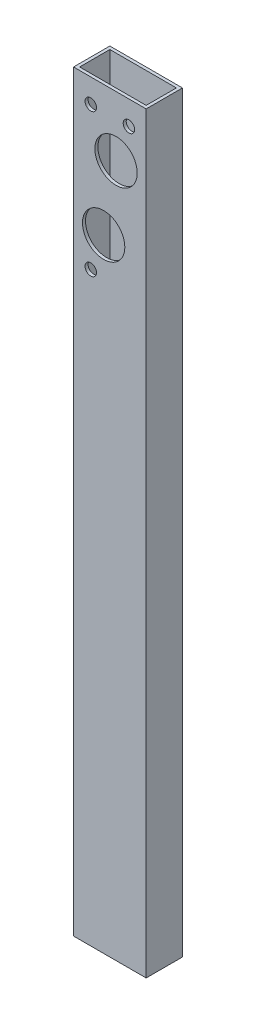
ISO-10303-21;
HEADER;
FILE_DESCRIPTION(('STEP AP214'),'2;1');
FILE_NAME('part.step','',(''),(''),'','','');
FILE_SCHEMA(('AUTOMOTIVE_DESIGN { 1 0 10303 214 1 1 1 1 }'));
ENDSEC;
DATA;
#1=APPLICATION_CONTEXT('core data for automotive mechanical design processes');
#2=APPLICATION_PROTOCOL_DEFINITION('international standard','automotive_design',2000,#1);
#3=PRODUCT_CONTEXT('',#1,'mechanical');
#4=PRODUCT('Part','Part','',(#3));
#5=PRODUCT_RELATED_PRODUCT_CATEGORY('part','',(#4));
#6=PRODUCT_DEFINITION_FORMATION('','',#4);
#7=PRODUCT_DEFINITION_CONTEXT('part definition',#1,'design');
#8=PRODUCT_DEFINITION('design','',#6,#7);
#9=PRODUCT_DEFINITION_SHAPE('','',#8);
#10=(LENGTH_UNIT() NAMED_UNIT(*) SI_UNIT(.MILLI.,.METRE.));
#11=(NAMED_UNIT(*) PLANE_ANGLE_UNIT() SI_UNIT($,.RADIAN.));
#12=(NAMED_UNIT(*) SI_UNIT($,.STERADIAN.) SOLID_ANGLE_UNIT());
#13=UNCERTAINTY_MEASURE_WITH_UNIT(LENGTH_MEASURE(1.E-05),#10,'distance_accuracy_value','');
#14=(GEOMETRIC_REPRESENTATION_CONTEXT(3) GLOBAL_UNCERTAINTY_ASSIGNED_CONTEXT((#13)) GLOBAL_UNIT_ASSIGNED_CONTEXT((#10,
#11,#12)) REPRESENTATION_CONTEXT('',''));
#15=CARTESIAN_POINT('',(0.,0.,0.));
#16=DIRECTION('',(0.,0.,1.));
#17=DIRECTION('',(1.,0.,0.));
#18=AXIS2_PLACEMENT_3D('',#15,#16,#17);
#19=CARTESIAN_POINT('',(38.1,-280.,-19.05));
#20=DIRECTION('',(1.,0.,0.));
#21=DIRECTION('',(0.,0.,-1.));
#22=AXIS2_PLACEMENT_3D('',#19,#20,#21);
#23=PLANE('',#22);
#24=DIRECTION('',(0.,1.,0.));
#25=VECTOR('',#24,1.);
#26=CARTESIAN_POINT('',(38.1,-280.,-19.05));
#27=LINE('',#26,#25);
#28=CARTESIAN_POINT('',(38.1,-280.,-19.05));
#29=VERTEX_POINT('',#28);
#30=CARTESIAN_POINT('',(38.1,510.,-19.05));
#31=VERTEX_POINT('',#30);
#32=EDGE_CURVE('E106',#29,#31,#27,.T.);
#33=ORIENTED_EDGE('',*,*,#32,.T.);
#34=DIRECTION('',(0.,0.,-1.));
#35=VECTOR('',#34,1.);
#36=CARTESIAN_POINT('',(38.1,510.,-19.05));
#37=LINE('',#36,#35);
#38=CARTESIAN_POINT('',(38.1,510.,19.05));
#39=VERTEX_POINT('',#38);
#40=EDGE_CURVE('E216',#39,#31,#37,.T.);
#41=ORIENTED_EDGE('',*,*,#40,.F.);
#42=DIRECTION('',(0.,1.,0.));
#43=VECTOR('',#42,1.);
#44=CARTESIAN_POINT('',(38.1,-280.,19.05));
#45=LINE('',#44,#43);
#46=CARTESIAN_POINT('',(38.1,-280.,19.05));
#47=VERTEX_POINT('',#46);
#48=EDGE_CURVE('E14',#47,#39,#45,.T.);
#49=ORIENTED_EDGE('',*,*,#48,.F.);
#50=DIRECTION('',(0.,0.,-1.));
#51=VECTOR('',#50,1.);
#52=CARTESIAN_POINT('',(38.1,-280.,-19.05));
#53=LINE('',#52,#51);
#54=EDGE_CURVE('E244',#47,#29,#53,.T.);
#55=ORIENTED_EDGE('',*,*,#54,.T.);
#56=EDGE_LOOP('',(#33,#41,#49,#55));
#57=FACE_BOUND('',#56,.T.);
#58=ADVANCED_FACE('F103',(#57),#23,.T.);
#59=CARTESIAN_POINT('',(-38.1,-280.,19.05));
#60=DIRECTION('',(0.,0.,1.));
#61=DIRECTION('',(1.,0.,0.));
#62=AXIS2_PLACEMENT_3D('',#59,#60,#61);
#63=PLANE('',#62);
#64=CARTESIAN_POINT('',(-20.,485.,19.05));
#65=DIRECTION('',(0.,0.,1.));
#66=DIRECTION('',(1.,0.,0.));
#67=AXIS2_PLACEMENT_3D('',#64,#65,#66);
#68=CIRCLE('',#67,6.);
#69=CARTESIAN_POINT('',(-14.,485.,19.05));
#70=VERTEX_POINT('',#69);
#71=EDGE_CURVE('E589',#70,#70,#68,.T.);
#72=ORIENTED_EDGE('',*,*,#71,.F.);
#73=EDGE_LOOP('',(#72));
#74=FACE_BOUND('',#73,.T.);
#75=CARTESIAN_POINT('',(20.,485.,19.05));
#76=DIRECTION('',(0.,0.,1.));
#77=DIRECTION('',(1.,0.,0.));
#78=AXIS2_PLACEMENT_3D('',#75,#76,#77);
#79=CIRCLE('',#78,6.);
#80=CARTESIAN_POINT('',(26.,485.,19.05));
#81=VERTEX_POINT('',#80);
#82=EDGE_CURVE('E597',#81,#81,#79,.T.);
#83=ORIENTED_EDGE('',*,*,#82,.F.);
#84=EDGE_LOOP('',(#83));
#85=FACE_BOUND('',#84,.T.);
#86=CARTESIAN_POINT('',(-20.,335.,19.05));
#87=DIRECTION('',(0.,0.,1.));
#88=DIRECTION('',(1.,0.,0.));
#89=AXIS2_PLACEMENT_3D('',#86,#87,#88);
#90=CIRCLE('',#89,6.);
#91=CARTESIAN_POINT('',(-14.,335.,19.05));
#92=VERTEX_POINT('',#91);
#93=EDGE_CURVE('E605',#92,#92,#90,.T.);
#94=ORIENTED_EDGE('',*,*,#93,.F.);
#95=EDGE_LOOP('',(#94));
#96=FACE_BOUND('',#95,.T.);
#97=CARTESIAN_POINT('',(6.51180666250989,446.930290737958,19.05));
#98=DIRECTION('',(0.,0.,1.));
#99=DIRECTION('',(1.,0.,0.));
#100=AXIS2_PLACEMENT_3D('',#97,#98,#99);
#101=CIRCLE('',#100,22.2249999999999);
#102=CARTESIAN_POINT('',(28.7368066625098,446.930290737958,19.05));
#103=VERTEX_POINT('',#102);
#104=EDGE_CURVE('E614',#103,#103,#101,.T.);
#105=ORIENTED_EDGE('',*,*,#104,.F.);
#106=EDGE_LOOP('',(#105));
#107=FACE_BOUND('',#106,.T.);
#108=CARTESIAN_POINT('',(-6.5118066625099,373.069709262042,19.05));
#109=DIRECTION('',(0.,0.,1.));
#110=DIRECTION('',(1.,0.,0.));
#111=AXIS2_PLACEMENT_3D('',#108,#109,#110);
#112=CIRCLE('',#111,22.225);
#113=CARTESIAN_POINT('',(15.7131933374901,373.069709262042,19.05));
#114=VERTEX_POINT('',#113);
#115=EDGE_CURVE('E613',#114,#114,#112,.T.);
#116=ORIENTED_EDGE('',*,*,#115,.F.);
#117=EDGE_LOOP('',(#116));
#118=FACE_BOUND('',#117,.T.);
#119=ORIENTED_EDGE('',*,*,#48,.T.);
#120=DIRECTION('',(1.,0.,0.));
#121=VECTOR('',#120,1.);
#122=CARTESIAN_POINT('',(-38.1,510.,19.05));
#123=LINE('',#122,#121);
#124=CARTESIAN_POINT('',(-38.1,510.,19.05));
#125=VERTEX_POINT('',#124);
#126=EDGE_CURVE('E228',#125,#39,#123,.T.);
#127=ORIENTED_EDGE('',*,*,#126,.F.);
#128=DIRECTION('',(0.,1.,0.));
#129=VECTOR('',#128,1.);
#130=CARTESIAN_POINT('',(-38.1,-280.,19.05));
#131=LINE('',#130,#129);
#132=CARTESIAN_POINT('',(-38.1,-280.,19.05));
#133=VERTEX_POINT('',#132);
#134=EDGE_CURVE('E112',#133,#125,#131,.T.);
#135=ORIENTED_EDGE('',*,*,#134,.F.);
#136=DIRECTION('',(1.,0.,0.));
#137=VECTOR('',#136,1.);
#138=CARTESIAN_POINT('',(-38.1,-280.,19.05));
#139=LINE('',#138,#137);
#140=EDGE_CURVE('E260',#133,#47,#139,.T.);
#141=ORIENTED_EDGE('',*,*,#140,.T.);
#142=EDGE_LOOP('',(#119,#127,#135,#141));
#143=FACE_BOUND('',#142,.T.);
#144=ADVANCED_FACE('F280',(#74,#85,#96,#107,#118,#143),#63,.T.);
#145=CARTESIAN_POINT('',(-38.1,-280.,-19.05));
#146=DIRECTION('',(-1.,0.,0.));
#147=DIRECTION('',(0.,0.,1.));
#148=AXIS2_PLACEMENT_3D('',#145,#146,#147);
#149=PLANE('',#148);
#150=ORIENTED_EDGE('',*,*,#134,.T.);
#151=DIRECTION('',(0.,0.,1.));
#152=VECTOR('',#151,1.);
#153=CARTESIAN_POINT('',(-38.1,510.,-19.05));
#154=LINE('',#153,#152);
#155=CARTESIAN_POINT('',(-38.1,510.,-19.05));
#156=VERTEX_POINT('',#155);
#157=EDGE_CURVE('E224',#156,#125,#154,.T.);
#158=ORIENTED_EDGE('',*,*,#157,.F.);
#159=DIRECTION('',(0.,1.,0.));
#160=VECTOR('',#159,1.);
#161=CARTESIAN_POINT('',(-38.1,-280.,-19.05));
#162=LINE('',#161,#160);
#163=CARTESIAN_POINT('',(-38.1,-280.,-19.05));
#164=VERTEX_POINT('',#163);
#165=EDGE_CURVE('E265',#164,#156,#162,.T.);
#166=ORIENTED_EDGE('',*,*,#165,.F.);
#167=DIRECTION('',(0.,0.,1.));
#168=VECTOR('',#167,1.);
#169=CARTESIAN_POINT('',(-38.1,-280.,-19.05));
#170=LINE('',#169,#168);
#171=EDGE_CURVE('E256',#164,#133,#170,.T.);
#172=ORIENTED_EDGE('',*,*,#171,.T.);
#173=EDGE_LOOP('',(#150,#158,#166,#172));
#174=FACE_BOUND('',#173,.T.);
#175=ADVANCED_FACE('F286',(#174),#149,.T.);
#176=CARTESIAN_POINT('',(-38.1,-280.,-19.05));
#177=DIRECTION('',(0.,0.,-1.));
#178=DIRECTION('',(-1.,0.,0.));
#179=AXIS2_PLACEMENT_3D('',#176,#177,#178);
#180=PLANE('',#179);
#181=CARTESIAN_POINT('',(0.,-50.,-19.05));
#182=DIRECTION('',(0.,0.,-1.));
#183=DIRECTION('',(-1.,0.,0.));
#184=AXIS2_PLACEMENT_3D('',#181,#182,#183);
#185=CIRCLE('',#184,22.225);
#186=CARTESIAN_POINT('',(-22.225,-50.,-19.05));
#187=VERTEX_POINT('',#186);
#188=EDGE_CURVE('E538',#187,#187,#185,.T.);
#189=ORIENTED_EDGE('',*,*,#188,.F.);
#190=EDGE_LOOP('',(#189));
#191=FACE_BOUND('',#190,.T.);
#192=CARTESIAN_POINT('',(0.,-220.,-19.05));
#193=DIRECTION('',(0.,0.,-1.));
#194=DIRECTION('',(-1.,0.,0.));
#195=AXIS2_PLACEMENT_3D('',#192,#193,#194);
#196=CIRCLE('',#195,22.225);
#197=CARTESIAN_POINT('',(-22.225,-220.,-19.05));
#198=VERTEX_POINT('',#197);
#199=EDGE_CURVE('E543',#198,#198,#196,.T.);
#200=ORIENTED_EDGE('',*,*,#199,.F.);
#201=EDGE_LOOP('',(#200));
#202=FACE_BOUND('',#201,.T.);
#203=CARTESIAN_POINT('',(20.,-15.,-19.05));
#204=DIRECTION('',(0.,0.,-1.));
#205=DIRECTION('',(-1.,0.,0.));
#206=AXIS2_PLACEMENT_3D('',#203,#204,#205);
#207=CIRCLE('',#206,6.);
#208=CARTESIAN_POINT('',(14.,-15.,-19.05));
#209=VERTEX_POINT('',#208);
#210=EDGE_CURVE('E549',#209,#209,#207,.T.);
#211=ORIENTED_EDGE('',*,*,#210,.F.);
#212=EDGE_LOOP('',(#211));
#213=FACE_BOUND('',#212,.T.);
#214=CARTESIAN_POINT('',(-20.,-255.,-19.05));
#215=DIRECTION('',(0.,0.,-1.));
#216=DIRECTION('',(-1.,0.,0.));
#217=AXIS2_PLACEMENT_3D('',#214,#215,#216);
#218=CIRCLE('',#217,6.);
#219=CARTESIAN_POINT('',(-26.,-255.,-19.05));
#220=VERTEX_POINT('',#219);
#221=EDGE_CURVE('E565',#220,#220,#218,.T.);
#222=ORIENTED_EDGE('',*,*,#221,.F.);
#223=EDGE_LOOP('',(#222));
#224=FACE_BOUND('',#223,.T.);
#225=CARTESIAN_POINT('',(20.,-255.,-19.05));
#226=DIRECTION('',(0.,0.,-1.));
#227=DIRECTION('',(-1.,0.,0.));
#228=AXIS2_PLACEMENT_3D('',#225,#226,#227);
#229=CIRCLE('',#228,6.);
#230=CARTESIAN_POINT('',(14.,-255.,-19.05));
#231=VERTEX_POINT('',#230);
#232=EDGE_CURVE('E573',#231,#231,#229,.T.);
#233=ORIENTED_EDGE('',*,*,#232,.F.);
#234=EDGE_LOOP('',(#233));
#235=FACE_BOUND('',#234,.T.);
#236=CARTESIAN_POINT('',(-20.,-15.,-19.05));
#237=DIRECTION('',(0.,0.,-1.));
#238=DIRECTION('',(-1.,0.,0.));
#239=AXIS2_PLACEMENT_3D('',#236,#237,#238);
#240=CIRCLE('',#239,6.);
#241=CARTESIAN_POINT('',(-26.,-15.,-19.05));
#242=VERTEX_POINT('',#241);
#243=EDGE_CURVE('E581',#242,#242,#240,.T.);
#244=ORIENTED_EDGE('',*,*,#243,.F.);
#245=EDGE_LOOP('',(#244));
#246=FACE_BOUND('',#245,.T.);
#247=ORIENTED_EDGE('',*,*,#165,.T.);
#248=DIRECTION('',(-1.,0.,0.));
#249=VECTOR('',#248,1.);
#250=CARTESIAN_POINT('',(-38.1,510.,-19.05));
#251=LINE('',#250,#249);
#252=EDGE_CURVE('E220',#31,#156,#251,.T.);
#253=ORIENTED_EDGE('',*,*,#252,.F.);
#254=ORIENTED_EDGE('',*,*,#32,.F.);
#255=DIRECTION('',(-1.,0.,0.));
#256=VECTOR('',#255,1.);
#257=CARTESIAN_POINT('',(-38.1,-280.,-19.05));
#258=LINE('',#257,#256);
#259=EDGE_CURVE('E252',#29,#164,#258,.T.);
#260=ORIENTED_EDGE('',*,*,#259,.T.);
#261=EDGE_LOOP('',(#247,#253,#254,#260));
#262=FACE_BOUND('',#261,.T.);
#263=ADVANCED_FACE('F275',(#191,#202,#213,#224,#235,#246,#262),#180,.T.);
#264=CARTESIAN_POINT('',(0.,-280.,0.));
#265=DIRECTION('',(0.,1.,0.));
#266=DIRECTION('',(0.,0.,1.));
#267=AXIS2_PLACEMENT_3D('',#264,#265,#266);
#268=PLANE('',#267);
#269=DIRECTION('',(1.,0.,0.));
#270=VECTOR('',#269,1.);
#271=CARTESIAN_POINT('',(-38.1,-280.,15.875));
#272=LINE('',#271,#270);
#273=CARTESIAN_POINT('',(-34.925,-280.,15.875));
#274=VERTEX_POINT('',#273);
#275=CARTESIAN_POINT('',(34.925,-280.,15.875));
#276=VERTEX_POINT('',#275);
#277=EDGE_CURVE('E190',#274,#276,#272,.T.);
#278=ORIENTED_EDGE('',*,*,#277,.T.);
#279=DIRECTION('',(0.,0.,-1.));
#280=VECTOR('',#279,1.);
#281=CARTESIAN_POINT('',(34.925,-280.,-19.05));
#282=LINE('',#281,#280);
#283=CARTESIAN_POINT('',(34.925,-280.,-15.875));
#284=VERTEX_POINT('',#283);
#285=EDGE_CURVE('E232',#276,#284,#282,.T.);
#286=ORIENTED_EDGE('',*,*,#285,.T.);
#287=DIRECTION('',(-1.,0.,0.));
#288=VECTOR('',#287,1.);
#289=CARTESIAN_POINT('',(-38.1,-280.,-15.875));
#290=LINE('',#289,#288);
#291=CARTESIAN_POINT('',(-34.925,-280.,-15.875));
#292=VERTEX_POINT('',#291);
#293=EDGE_CURVE('E184',#284,#292,#290,.T.);
#294=ORIENTED_EDGE('',*,*,#293,.T.);
#295=DIRECTION('',(0.,0.,1.));
#296=VECTOR('',#295,1.);
#297=CARTESIAN_POINT('',(-34.925,-280.,-19.05));
#298=LINE('',#297,#296);
#299=EDGE_CURVE('E120',#292,#274,#298,.T.);
#300=ORIENTED_EDGE('',*,*,#299,.T.);
#301=EDGE_LOOP('',(#278,#286,#294,#300));
#302=FACE_BOUND('',#301,.T.);
#303=ORIENTED_EDGE('',*,*,#54,.F.);
#304=ORIENTED_EDGE('',*,*,#140,.F.);
#305=ORIENTED_EDGE('',*,*,#171,.F.);
#306=ORIENTED_EDGE('',*,*,#259,.F.);
#307=EDGE_LOOP('',(#303,#304,#305,#306));
#308=FACE_BOUND('',#307,.T.);
#309=ADVANCED_FACE('F284',(#302,#308),#268,.F.);
#310=CARTESIAN_POINT('',(34.925,-280.,-19.05));
#311=DIRECTION('',(1.,0.,0.));
#312=DIRECTION('',(0.,0.,-1.));
#313=AXIS2_PLACEMENT_3D('',#310,#311,#312);
#314=PLANE('',#313);
#315=DIRECTION('',(0.,1.,0.));
#316=VECTOR('',#315,1.);
#317=CARTESIAN_POINT('',(34.925,-280.,15.875));
#318=LINE('',#317,#316);
#319=CARTESIAN_POINT('',(34.925,510.,15.875));
#320=VERTEX_POINT('',#319);
#321=EDGE_CURVE('E195',#276,#320,#318,.T.);
#322=ORIENTED_EDGE('',*,*,#321,.T.);
#323=DIRECTION('',(0.,0.,-1.));
#324=VECTOR('',#323,1.);
#325=CARTESIAN_POINT('',(34.925,510.,-19.05));
#326=LINE('',#325,#324);
#327=CARTESIAN_POINT('',(34.925,510.,-15.875));
#328=VERTEX_POINT('',#327);
#329=EDGE_CURVE('E193',#320,#328,#326,.T.);
#330=ORIENTED_EDGE('',*,*,#329,.T.);
#331=DIRECTION('',(0.,1.,0.));
#332=VECTOR('',#331,1.);
#333=CARTESIAN_POINT('',(34.925,-280.,-15.875));
#334=LINE('',#333,#332);
#335=EDGE_CURVE('E177',#284,#328,#334,.T.);
#336=ORIENTED_EDGE('',*,*,#335,.F.);
#337=ORIENTED_EDGE('',*,*,#285,.F.);
#338=EDGE_LOOP('',(#322,#330,#336,#337));
#339=FACE_BOUND('',#338,.T.);
#340=ADVANCED_FACE('F194',(#339),#314,.F.);
#341=CARTESIAN_POINT('',(-38.1,-280.,15.875));
#342=DIRECTION('',(0.,0.,1.));
#343=DIRECTION('',(1.,0.,0.));
#344=AXIS2_PLACEMENT_3D('',#341,#342,#343);
#345=PLANE('',#344);
#346=CARTESIAN_POINT('',(-20.,485.,15.875));
#347=DIRECTION('',(0.,0.,1.));
#348=DIRECTION('',(1.,0.,0.));
#349=AXIS2_PLACEMENT_3D('',#346,#347,#348);
#350=CIRCLE('',#349,6.);
#351=CARTESIAN_POINT('',(-14.,485.,15.875));
#352=VERTEX_POINT('',#351);
#353=EDGE_CURVE('E593',#352,#352,#350,.T.);
#354=ORIENTED_EDGE('',*,*,#353,.T.);
#355=EDGE_LOOP('',(#354));
#356=FACE_BOUND('',#355,.T.);
#357=CARTESIAN_POINT('',(20.,485.,15.875));
#358=DIRECTION('',(0.,0.,1.));
#359=DIRECTION('',(1.,0.,0.));
#360=AXIS2_PLACEMENT_3D('',#357,#358,#359);
#361=CIRCLE('',#360,6.);
#362=CARTESIAN_POINT('',(26.,485.,15.875));
#363=VERTEX_POINT('',#362);
#364=EDGE_CURVE('E601',#363,#363,#361,.T.);
#365=ORIENTED_EDGE('',*,*,#364,.T.);
#366=EDGE_LOOP('',(#365));
#367=FACE_BOUND('',#366,.T.);
#368=CARTESIAN_POINT('',(-20.,335.,15.875));
#369=DIRECTION('',(0.,0.,1.));
#370=DIRECTION('',(1.,0.,0.));
#371=AXIS2_PLACEMENT_3D('',#368,#369,#370);
#372=CIRCLE('',#371,6.);
#373=CARTESIAN_POINT('',(-14.,335.,15.875));
#374=VERTEX_POINT('',#373);
#375=EDGE_CURVE('E609',#374,#374,#372,.T.);
#376=ORIENTED_EDGE('',*,*,#375,.T.);
#377=EDGE_LOOP('',(#376));
#378=FACE_BOUND('',#377,.T.);
#379=CARTESIAN_POINT('',(6.51180666250989,446.930290737958,15.875));
#380=DIRECTION('',(0.,0.,1.));
#381=DIRECTION('',(1.,0.,0.));
#382=AXIS2_PLACEMENT_3D('',#379,#380,#381);
#383=CIRCLE('',#382,22.2249999999999);
#384=CARTESIAN_POINT('',(28.7368066625098,446.930290737958,15.875));
#385=VERTEX_POINT('',#384);
#386=EDGE_CURVE('E200',#385,#385,#383,.F.);
#387=ORIENTED_EDGE('',*,*,#386,.F.);
#388=EDGE_LOOP('',(#387));
#389=FACE_BOUND('',#388,.T.);
#390=CARTESIAN_POINT('',(-6.5118066625099,373.069709262042,15.875));
#391=DIRECTION('',(0.,0.,1.));
#392=DIRECTION('',(1.,0.,0.));
#393=AXIS2_PLACEMENT_3D('',#390,#391,#392);
#394=CIRCLE('',#393,22.225);
#395=CARTESIAN_POINT('',(15.7131933374901,373.069709262042,15.875));
#396=VERTEX_POINT('',#395);
#397=EDGE_CURVE('E618',#396,#396,#394,.F.);
#398=ORIENTED_EDGE('',*,*,#397,.F.);
#399=EDGE_LOOP('',(#398));
#400=FACE_BOUND('',#399,.T.);
#401=DIRECTION('',(0.,1.,0.));
#402=VECTOR('',#401,1.);
#403=CARTESIAN_POINT('',(-34.925,-280.,15.875));
#404=LINE('',#403,#402);
#405=CARTESIAN_POINT('',(-34.925,510.,15.875));
#406=VERTEX_POINT('',#405);
#407=EDGE_CURVE('E245',#274,#406,#404,.T.);
#408=ORIENTED_EDGE('',*,*,#407,.T.);
#409=DIRECTION('',(1.,0.,0.));
#410=VECTOR('',#409,1.);
#411=CARTESIAN_POINT('',(-38.1,510.,15.875));
#412=LINE('',#411,#410);
#413=EDGE_CURVE('E210',#406,#320,#412,.T.);
#414=ORIENTED_EDGE('',*,*,#413,.T.);
#415=ORIENTED_EDGE('',*,*,#321,.F.);
#416=ORIENTED_EDGE('',*,*,#277,.F.);
#417=EDGE_LOOP('',(#408,#414,#415,#416));
#418=FACE_BOUND('',#417,.T.);
#419=ADVANCED_FACE('F332',(#356,#367,#378,#389,#400,#418),#345,.F.);
#420=CARTESIAN_POINT('',(-34.925,-280.,-19.05));
#421=DIRECTION('',(-1.,0.,0.));
#422=DIRECTION('',(0.,0.,1.));
#423=AXIS2_PLACEMENT_3D('',#420,#421,#422);
#424=PLANE('',#423);
#425=DIRECTION('',(0.,1.,0.));
#426=VECTOR('',#425,1.);
#427=CARTESIAN_POINT('',(-34.925,-280.,-15.875));
#428=LINE('',#427,#426);
#429=CARTESIAN_POINT('',(-34.925,510.,-15.875));
#430=VERTEX_POINT('',#429);
#431=EDGE_CURVE('E189',#292,#430,#428,.T.);
#432=ORIENTED_EDGE('',*,*,#431,.T.);
#433=DIRECTION('',(0.,0.,1.));
#434=VECTOR('',#433,1.);
#435=CARTESIAN_POINT('',(-34.925,510.,-19.05));
#436=LINE('',#435,#434);
#437=EDGE_CURVE('E204',#430,#406,#436,.T.);
#438=ORIENTED_EDGE('',*,*,#437,.T.);
#439=ORIENTED_EDGE('',*,*,#407,.F.);
#440=ORIENTED_EDGE('',*,*,#299,.F.);
#441=EDGE_LOOP('',(#432,#438,#439,#440));
#442=FACE_BOUND('',#441,.T.);
#443=ADVANCED_FACE('F338',(#442),#424,.F.);
#444=CARTESIAN_POINT('',(-38.1,-280.,-15.875));
#445=DIRECTION('',(0.,0.,-1.));
#446=DIRECTION('',(-1.,0.,0.));
#447=AXIS2_PLACEMENT_3D('',#444,#445,#446);
#448=PLANE('',#447);
#449=CARTESIAN_POINT('',(0.,-50.,-15.875));
#450=DIRECTION('',(0.,0.,-1.));
#451=DIRECTION('',(-1.,0.,0.));
#452=AXIS2_PLACEMENT_3D('',#449,#450,#451);
#453=CIRCLE('',#452,22.225);
#454=CARTESIAN_POINT('',(-22.225,-50.,-15.875));
#455=VERTEX_POINT('',#454);
#456=EDGE_CURVE('E541',#455,#455,#453,.F.);
#457=ORIENTED_EDGE('',*,*,#456,.F.);
#458=EDGE_LOOP('',(#457));
#459=FACE_BOUND('',#458,.T.);
#460=CARTESIAN_POINT('',(0.,-220.,-15.875));
#461=DIRECTION('',(0.,0.,-1.));
#462=DIRECTION('',(-1.,0.,0.));
#463=AXIS2_PLACEMENT_3D('',#460,#461,#462);
#464=CIRCLE('',#463,22.225);
#465=CARTESIAN_POINT('',(-22.225,-220.,-15.875));
#466=VERTEX_POINT('',#465);
#467=EDGE_CURVE('E552',#466,#466,#464,.F.);
#468=ORIENTED_EDGE('',*,*,#467,.F.);
#469=EDGE_LOOP('',(#468));
#470=FACE_BOUND('',#469,.T.);
#471=CARTESIAN_POINT('',(20.,-15.,-15.875));
#472=DIRECTION('',(0.,0.,-1.));
#473=DIRECTION('',(-1.,0.,0.));
#474=AXIS2_PLACEMENT_3D('',#471,#472,#473);
#475=CIRCLE('',#474,6.);
#476=CARTESIAN_POINT('',(14.,-15.,-15.875));
#477=VERTEX_POINT('',#476);
#478=EDGE_CURVE('E561',#477,#477,#475,.T.);
#479=ORIENTED_EDGE('',*,*,#478,.T.);
#480=EDGE_LOOP('',(#479));
#481=FACE_BOUND('',#480,.T.);
#482=CARTESIAN_POINT('',(-20.,-255.,-15.875));
#483=DIRECTION('',(0.,0.,-1.));
#484=DIRECTION('',(-1.,0.,0.));
#485=AXIS2_PLACEMENT_3D('',#482,#483,#484);
#486=CIRCLE('',#485,6.);
#487=CARTESIAN_POINT('',(-26.,-255.,-15.875));
#488=VERTEX_POINT('',#487);
#489=EDGE_CURVE('E569',#488,#488,#486,.T.);
#490=ORIENTED_EDGE('',*,*,#489,.T.);
#491=EDGE_LOOP('',(#490));
#492=FACE_BOUND('',#491,.T.);
#493=CARTESIAN_POINT('',(20.,-255.,-15.875));
#494=DIRECTION('',(0.,0.,-1.));
#495=DIRECTION('',(-1.,0.,0.));
#496=AXIS2_PLACEMENT_3D('',#493,#494,#495);
#497=CIRCLE('',#496,6.);
#498=CARTESIAN_POINT('',(14.,-255.,-15.875));
#499=VERTEX_POINT('',#498);
#500=EDGE_CURVE('E577',#499,#499,#497,.T.);
#501=ORIENTED_EDGE('',*,*,#500,.T.);
#502=EDGE_LOOP('',(#501));
#503=FACE_BOUND('',#502,.T.);
#504=CARTESIAN_POINT('',(-20.,-15.,-15.875));
#505=DIRECTION('',(0.,0.,-1.));
#506=DIRECTION('',(-1.,0.,0.));
#507=AXIS2_PLACEMENT_3D('',#504,#505,#506);
#508=CIRCLE('',#507,6.);
#509=CARTESIAN_POINT('',(-26.,-15.,-15.875));
#510=VERTEX_POINT('',#509);
#511=EDGE_CURVE('E585',#510,#510,#508,.T.);
#512=ORIENTED_EDGE('',*,*,#511,.T.);
#513=EDGE_LOOP('',(#512));
#514=FACE_BOUND('',#513,.T.);
#515=ORIENTED_EDGE('',*,*,#335,.T.);
#516=DIRECTION('',(-1.,0.,0.));
#517=VECTOR('',#516,1.);
#518=CARTESIAN_POINT('',(-38.1,510.,-15.875));
#519=LINE('',#518,#517);
#520=EDGE_CURVE('E181',#328,#430,#519,.T.);
#521=ORIENTED_EDGE('',*,*,#520,.T.);
#522=ORIENTED_EDGE('',*,*,#431,.F.);
#523=ORIENTED_EDGE('',*,*,#293,.F.);
#524=EDGE_LOOP('',(#515,#521,#522,#523));
#525=FACE_BOUND('',#524,.T.);
#526=ADVANCED_FACE('F179',(#459,#470,#481,#492,#503,#514,#525),#448,.F.);
#527=CARTESIAN_POINT('',(0.,510.,0.));
#528=DIRECTION('',(0.,1.,0.));
#529=DIRECTION('',(0.,0.,1.));
#530=AXIS2_PLACEMENT_3D('',#527,#528,#529);
#531=PLANE('',#530);
#532=ORIENTED_EDGE('',*,*,#40,.T.);
#533=ORIENTED_EDGE('',*,*,#252,.T.);
#534=ORIENTED_EDGE('',*,*,#157,.T.);
#535=ORIENTED_EDGE('',*,*,#126,.T.);
#536=EDGE_LOOP('',(#532,#533,#534,#535));
#537=FACE_BOUND('',#536,.T.);
#538=ORIENTED_EDGE('',*,*,#520,.F.);
#539=ORIENTED_EDGE('',*,*,#329,.F.);
#540=ORIENTED_EDGE('',*,*,#413,.F.);
#541=ORIENTED_EDGE('',*,*,#437,.F.);
#542=EDGE_LOOP('',(#538,#539,#540,#541));
#543=FACE_BOUND('',#542,.T.);
#544=ADVANCED_FACE('F202',(#537,#543),#531,.T.);
#545=CARTESIAN_POINT('',(-6.5118066625099,373.069709262042,-19.051));
#546=DIRECTION('',(0.,0.,1.));
#547=DIRECTION('',(1.,0.,0.));
#548=AXIS2_PLACEMENT_3D('',#545,#546,#547);
#549=CYLINDRICAL_SURFACE('',#548,22.225);
#550=ORIENTED_EDGE('',*,*,#115,.T.);
#551=EDGE_LOOP('',(#550));
#552=FACE_BOUND('',#551,.T.);
#553=ORIENTED_EDGE('',*,*,#397,.T.);
#554=EDGE_LOOP('',(#553));
#555=FACE_BOUND('',#554,.T.);
#556=ADVANCED_FACE('F361',(#552,#555),#549,.F.);
#557=CARTESIAN_POINT('',(6.51180666250989,446.930290737958,-19.051));
#558=DIRECTION('',(0.,0.,1.));
#559=DIRECTION('',(1.,0.,0.));
#560=AXIS2_PLACEMENT_3D('',#557,#558,#559);
#561=CYLINDRICAL_SURFACE('',#560,22.2249999999999);
#562=ORIENTED_EDGE('',*,*,#104,.T.);
#563=EDGE_LOOP('',(#562));
#564=FACE_BOUND('',#563,.T.);
#565=ORIENTED_EDGE('',*,*,#386,.T.);
#566=EDGE_LOOP('',(#565));
#567=FACE_BOUND('',#566,.T.);
#568=ADVANCED_FACE('F370',(#564,#567),#561,.F.);
#569=CARTESIAN_POINT('',(-20.,335.,19.05));
#570=DIRECTION('',(0.,0.,1.));
#571=DIRECTION('',(1.,0.,0.));
#572=AXIS2_PLACEMENT_3D('',#569,#570,#571);
#573=CYLINDRICAL_SURFACE('',#572,6.);
#574=ORIENTED_EDGE('',*,*,#375,.F.);
#575=EDGE_LOOP('',(#574));
#576=FACE_BOUND('',#575,.T.);
#577=ORIENTED_EDGE('',*,*,#93,.T.);
#578=EDGE_LOOP('',(#577));
#579=FACE_BOUND('',#578,.T.);
#580=ADVANCED_FACE('F379',(#576,#579),#573,.F.);
#581=CARTESIAN_POINT('',(20.,485.,19.05));
#582=DIRECTION('',(0.,0.,1.));
#583=DIRECTION('',(1.,0.,0.));
#584=AXIS2_PLACEMENT_3D('',#581,#582,#583);
#585=CYLINDRICAL_SURFACE('',#584,6.);
#586=ORIENTED_EDGE('',*,*,#364,.F.);
#587=EDGE_LOOP('',(#586));
#588=FACE_BOUND('',#587,.T.);
#589=ORIENTED_EDGE('',*,*,#82,.T.);
#590=EDGE_LOOP('',(#589));
#591=FACE_BOUND('',#590,.T.);
#592=ADVANCED_FACE('F389',(#588,#591),#585,.F.);
#593=CARTESIAN_POINT('',(-20.,485.,19.05));
#594=DIRECTION('',(0.,0.,1.));
#595=DIRECTION('',(1.,0.,0.));
#596=AXIS2_PLACEMENT_3D('',#593,#594,#595);
#597=CYLINDRICAL_SURFACE('',#596,6.);
#598=ORIENTED_EDGE('',*,*,#353,.F.);
#599=EDGE_LOOP('',(#598));
#600=FACE_BOUND('',#599,.T.);
#601=ORIENTED_EDGE('',*,*,#71,.T.);
#602=EDGE_LOOP('',(#601));
#603=FACE_BOUND('',#602,.T.);
#604=ADVANCED_FACE('F399',(#600,#603),#597,.F.);
#605=CARTESIAN_POINT('',(-20.,-15.,-19.05));
#606=DIRECTION('',(0.,0.,-1.));
#607=DIRECTION('',(-1.,0.,0.));
#608=AXIS2_PLACEMENT_3D('',#605,#606,#607);
#609=CYLINDRICAL_SURFACE('',#608,6.);
#610=ORIENTED_EDGE('',*,*,#511,.F.);
#611=EDGE_LOOP('',(#610));
#612=FACE_BOUND('',#611,.T.);
#613=ORIENTED_EDGE('',*,*,#243,.T.);
#614=EDGE_LOOP('',(#613));
#615=FACE_BOUND('',#614,.T.);
#616=ADVANCED_FACE('F409',(#612,#615),#609,.F.);
#617=CARTESIAN_POINT('',(20.,-255.,-19.05));
#618=DIRECTION('',(0.,0.,-1.));
#619=DIRECTION('',(-1.,0.,0.));
#620=AXIS2_PLACEMENT_3D('',#617,#618,#619);
#621=CYLINDRICAL_SURFACE('',#620,6.);
#622=ORIENTED_EDGE('',*,*,#500,.F.);
#623=EDGE_LOOP('',(#622));
#624=FACE_BOUND('',#623,.T.);
#625=ORIENTED_EDGE('',*,*,#232,.T.);
#626=EDGE_LOOP('',(#625));
#627=FACE_BOUND('',#626,.T.);
#628=ADVANCED_FACE('F419',(#624,#627),#621,.F.);
#629=CARTESIAN_POINT('',(-20.,-255.,-19.05));
#630=DIRECTION('',(0.,0.,-1.));
#631=DIRECTION('',(-1.,0.,0.));
#632=AXIS2_PLACEMENT_3D('',#629,#630,#631);
#633=CYLINDRICAL_SURFACE('',#632,6.);
#634=ORIENTED_EDGE('',*,*,#489,.F.);
#635=EDGE_LOOP('',(#634));
#636=FACE_BOUND('',#635,.T.);
#637=ORIENTED_EDGE('',*,*,#221,.T.);
#638=EDGE_LOOP('',(#637));
#639=FACE_BOUND('',#638,.T.);
#640=ADVANCED_FACE('F429',(#636,#639),#633,.F.);
#641=CARTESIAN_POINT('',(20.,-15.,-19.05));
#642=DIRECTION('',(0.,0.,-1.));
#643=DIRECTION('',(-1.,0.,0.));
#644=AXIS2_PLACEMENT_3D('',#641,#642,#643);
#645=CYLINDRICAL_SURFACE('',#644,6.);
#646=ORIENTED_EDGE('',*,*,#478,.F.);
#647=EDGE_LOOP('',(#646));
#648=FACE_BOUND('',#647,.T.);
#649=ORIENTED_EDGE('',*,*,#210,.T.);
#650=EDGE_LOOP('',(#649));
#651=FACE_BOUND('',#650,.T.);
#652=ADVANCED_FACE('F439',(#648,#651),#645,.F.);
#653=CARTESIAN_POINT('',(0.,-220.,19.051));
#654=DIRECTION('',(0.,0.,-1.));
#655=DIRECTION('',(-1.,0.,0.));
#656=AXIS2_PLACEMENT_3D('',#653,#654,#655);
#657=CYLINDRICAL_SURFACE('',#656,22.225);
#658=ORIENTED_EDGE('',*,*,#199,.T.);
#659=EDGE_LOOP('',(#658));
#660=FACE_BOUND('',#659,.T.);
#661=ORIENTED_EDGE('',*,*,#467,.T.);
#662=EDGE_LOOP('',(#661));
#663=FACE_BOUND('',#662,.T.);
#664=ADVANCED_FACE('F449',(#660,#663),#657,.F.);
#665=CARTESIAN_POINT('',(0.,-50.,19.051));
#666=DIRECTION('',(0.,0.,-1.));
#667=DIRECTION('',(-1.,0.,0.));
#668=AXIS2_PLACEMENT_3D('',#665,#666,#667);
#669=CYLINDRICAL_SURFACE('',#668,22.225);
#670=ORIENTED_EDGE('',*,*,#188,.T.);
#671=EDGE_LOOP('',(#670));
#672=FACE_BOUND('',#671,.T.);
#673=ORIENTED_EDGE('',*,*,#456,.T.);
#674=EDGE_LOOP('',(#673));
#675=FACE_BOUND('',#674,.T.);
#676=ADVANCED_FACE('F458',(#672,#675),#669,.F.);
#677=CLOSED_SHELL('',(#58,#144,#175,#263,#309,#340,#419,#443,#526,#544,#556,#568,#580,#592,#604,
#616,#628,#640,#652,#664,#676));
#678=MANIFOLD_SOLID_BREP('B2',#677);
#679=ADVANCED_BREP_SHAPE_REPRESENTATION('',(#18,#678),#14);
#680=SHAPE_DEFINITION_REPRESENTATION(#9,#679);
ENDSEC;
END-ISO-10303-21;
